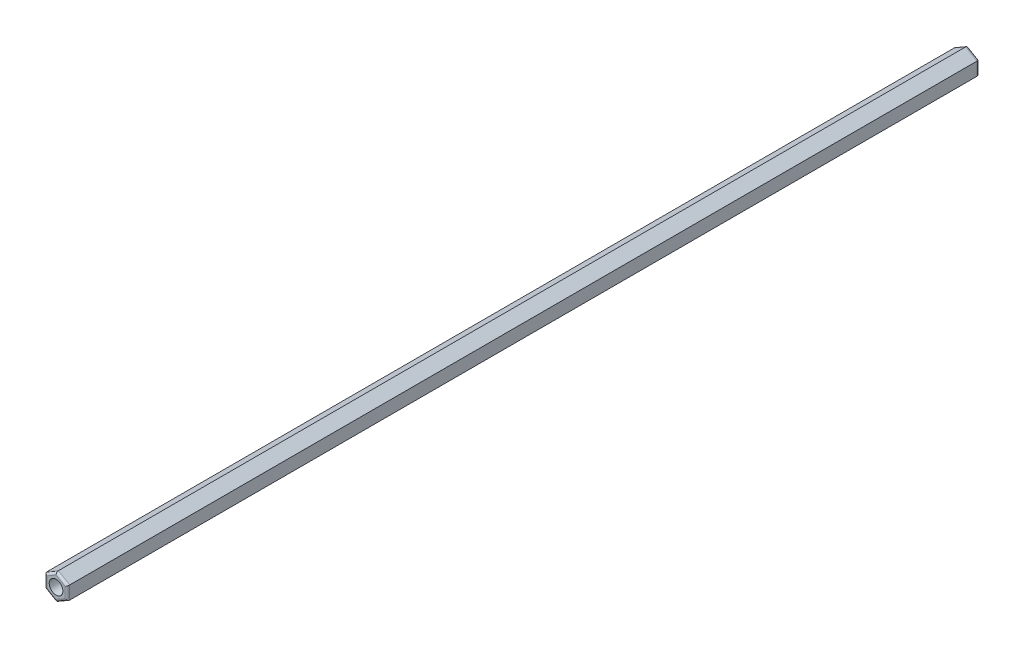
ISO-10303-21;
HEADER;
FILE_DESCRIPTION(('STEP AP214'),'2;1');
FILE_NAME('part.step','',(''),(''),'','','');
FILE_SCHEMA(('AUTOMOTIVE_DESIGN { 1 0 10303 214 1 1 1 1 }'));
ENDSEC;
DATA;
#1=APPLICATION_CONTEXT('core data for automotive mechanical design processes');
#2=APPLICATION_PROTOCOL_DEFINITION('international standard','automotive_design',2000,#1);
#3=PRODUCT_CONTEXT('',#1,'mechanical');
#4=PRODUCT('Part','Part','',(#3));
#5=PRODUCT_RELATED_PRODUCT_CATEGORY('part','',(#4));
#6=PRODUCT_DEFINITION_FORMATION('','',#4);
#7=PRODUCT_DEFINITION_CONTEXT('part definition',#1,'design');
#8=PRODUCT_DEFINITION('design','',#6,#7);
#9=PRODUCT_DEFINITION_SHAPE('','',#8);
#10=(LENGTH_UNIT() NAMED_UNIT(*) SI_UNIT(.MILLI.,.METRE.));
#11=(NAMED_UNIT(*) PLANE_ANGLE_UNIT() SI_UNIT($,.RADIAN.));
#12=(NAMED_UNIT(*) SI_UNIT($,.STERADIAN.) SOLID_ANGLE_UNIT());
#13=UNCERTAINTY_MEASURE_WITH_UNIT(LENGTH_MEASURE(1.E-05),#10,'distance_accuracy_value','');
#14=(GEOMETRIC_REPRESENTATION_CONTEXT(3) GLOBAL_UNCERTAINTY_ASSIGNED_CONTEXT((#13)) GLOBAL_UNIT_ASSIGNED_CONTEXT((#10,
#11,#12)) REPRESENTATION_CONTEXT('',''));
#15=CARTESIAN_POINT('',(0.,0.,0.));
#16=DIRECTION('',(0.,0.,1.));
#17=DIRECTION('',(1.,0.,0.));
#18=AXIS2_PLACEMENT_3D('',#15,#16,#17);
#19=CARTESIAN_POINT('',(-67.50212267549,1.44337567297406,200.));
#20=DIRECTION('',(1.,0.,0.));
#21=DIRECTION('',(0.,0.,-1.));
#22=AXIS2_PLACEMENT_3D('',#19,#20,#21);
#23=PLANE('',#22);
#24=DIRECTION('',(0.,0.,-1.));
#25=VECTOR('',#24,1.);
#26=CARTESIAN_POINT('',(-67.50212267549,-1.44337567297407,200.));
#27=LINE('',#26,#25);
#28=CARTESIAN_POINT('',(-67.50212267549,-1.44337567297407,199.5));
#29=VERTEX_POINT('',#28);
#30=CARTESIAN_POINT('',(-67.50212267549,-1.44337567297407,0.5));
#31=VERTEX_POINT('',#30);
#32=EDGE_CURVE('E152',#29,#31,#27,.T.);
#33=ORIENTED_EDGE('',*,*,#32,.T.);
#34=DIRECTION('',(0.,-1.,0.));
#35=VECTOR('',#34,1.);
#36=CARTESIAN_POINT('',(-67.50212267549,1.44337567297406,0.5));
#37=LINE('',#36,#35);
#38=CARTESIAN_POINT('',(-67.50212267549,1.44337567297406,0.5));
#39=VERTEX_POINT('',#38);
#40=EDGE_CURVE('E149',#31,#39,#37,.F.);
#41=ORIENTED_EDGE('',*,*,#40,.T.);
#42=DIRECTION('',(0.,0.,-1.));
#43=VECTOR('',#42,1.);
#44=CARTESIAN_POINT('',(-67.50212267549,1.44337567297406,200.));
#45=LINE('',#44,#43);
#46=CARTESIAN_POINT('',(-67.50212267549,1.44337567297406,199.5));
#47=VERTEX_POINT('',#46);
#48=EDGE_CURVE('E146',#47,#39,#45,.T.);
#49=ORIENTED_EDGE('',*,*,#48,.F.);
#50=DIRECTION('',(0.,-1.,0.));
#51=VECTOR('',#50,1.);
#52=CARTESIAN_POINT('',(-67.50212267549,-1.44337567297407,199.5));
#53=LINE('',#52,#51);
#54=EDGE_CURVE('E206',#47,#29,#53,.T.);
#55=ORIENTED_EDGE('',*,*,#54,.T.);
#56=EDGE_LOOP('',(#33,#41,#49,#55));
#57=FACE_BOUND('',#56,.T.);
#58=ADVANCED_FACE('F32',(#57),#23,.T.);
#59=CARTESIAN_POINT('',(-70.00212267549,2.88675134594811,200.));
#60=DIRECTION('',(0.5,0.866025403784439,0.));
#61=DIRECTION('',(-0.866025403784439,0.5,0.));
#62=AXIS2_PLACEMENT_3D('',#59,#60,#61);
#63=PLANE('',#62);
#64=ORIENTED_EDGE('',*,*,#48,.T.);
#65=DIRECTION('',(0.866025403784439,-0.5,0.));
#66=VECTOR('',#65,1.);
#67=CARTESIAN_POINT('',(-70.00212267549,2.88675134594811,0.5));
#68=LINE('',#67,#66);
#69=CARTESIAN_POINT('',(-70.00212267549,2.88675134594811,0.5));
#70=VERTEX_POINT('',#69);
#71=EDGE_CURVE('E191',#39,#70,#68,.F.);
#72=ORIENTED_EDGE('',*,*,#71,.T.);
#73=DIRECTION('',(0.,0.,-1.));
#74=VECTOR('',#73,1.);
#75=CARTESIAN_POINT('',(-70.00212267549,2.88675134594811,200.));
#76=LINE('',#75,#74);
#77=CARTESIAN_POINT('',(-70.00212267549,2.88675134594811,199.5));
#78=VERTEX_POINT('',#77);
#79=EDGE_CURVE('E255',#78,#70,#76,.T.);
#80=ORIENTED_EDGE('',*,*,#79,.F.);
#81=DIRECTION('',(0.866025403784439,-0.5,0.));
#82=VECTOR('',#81,1.);
#83=CARTESIAN_POINT('',(-67.50212267549,1.44337567297406,199.5));
#84=LINE('',#83,#82);
#85=EDGE_CURVE('E197',#78,#47,#84,.T.);
#86=ORIENTED_EDGE('',*,*,#85,.T.);
#87=EDGE_LOOP('',(#64,#72,#80,#86));
#88=FACE_BOUND('',#87,.T.);
#89=ADVANCED_FACE('F284',(#88),#63,.T.);
#90=CARTESIAN_POINT('',(-72.50212267549,1.44337567297405,200.));
#91=DIRECTION('',(-0.5,0.866025403784438,0.));
#92=DIRECTION('',(-0.866025403784439,-0.5,0.));
#93=AXIS2_PLACEMENT_3D('',#90,#91,#92);
#94=PLANE('',#93);
#95=ORIENTED_EDGE('',*,*,#79,.T.);
#96=DIRECTION('',(0.866025403784439,0.5,0.));
#97=VECTOR('',#96,1.);
#98=CARTESIAN_POINT('',(-72.50212267549,1.44337567297405,0.5));
#99=LINE('',#98,#97);
#100=CARTESIAN_POINT('',(-72.50212267549,1.44337567297405,0.5));
#101=VERTEX_POINT('',#100);
#102=EDGE_CURVE('E231',#70,#101,#99,.F.);
#103=ORIENTED_EDGE('',*,*,#102,.T.);
#104=DIRECTION('',(0.,0.,-1.));
#105=VECTOR('',#104,1.);
#106=CARTESIAN_POINT('',(-72.50212267549,1.44337567297405,200.));
#107=LINE('',#106,#105);
#108=CARTESIAN_POINT('',(-72.50212267549,1.44337567297405,199.5));
#109=VERTEX_POINT('',#108);
#110=EDGE_CURVE('E253',#109,#101,#107,.T.);
#111=ORIENTED_EDGE('',*,*,#110,.F.);
#112=DIRECTION('',(0.866025403784439,0.5,0.));
#113=VECTOR('',#112,1.);
#114=CARTESIAN_POINT('',(-70.00212267549,2.88675134594811,199.5));
#115=LINE('',#114,#113);
#116=EDGE_CURVE('E234',#109,#78,#115,.T.);
#117=ORIENTED_EDGE('',*,*,#116,.T.);
#118=EDGE_LOOP('',(#95,#103,#111,#117));
#119=FACE_BOUND('',#118,.T.);
#120=ADVANCED_FACE('F290',(#119),#94,.T.);
#121=CARTESIAN_POINT('',(-72.50212267549,-1.44337567297407,200.));
#122=DIRECTION('',(-1.,0.,0.));
#123=DIRECTION('',(0.,0.,1.));
#124=AXIS2_PLACEMENT_3D('',#121,#122,#123);
#125=PLANE('',#124);
#126=ORIENTED_EDGE('',*,*,#110,.T.);
#127=DIRECTION('',(0.,1.,0.));
#128=VECTOR('',#127,1.);
#129=CARTESIAN_POINT('',(-72.50212267549,-1.44337567297407,0.5));
#130=LINE('',#129,#128);
#131=CARTESIAN_POINT('',(-72.50212267549,-1.44337567297407,0.5));
#132=VERTEX_POINT('',#131);
#133=EDGE_CURVE('E201',#101,#132,#130,.F.);
#134=ORIENTED_EDGE('',*,*,#133,.T.);
#135=DIRECTION('',(0.,0.,-1.));
#136=VECTOR('',#135,1.);
#137=CARTESIAN_POINT('',(-72.50212267549,-1.44337567297407,200.));
#138=LINE('',#137,#136);
#139=CARTESIAN_POINT('',(-72.50212267549,-1.44337567297407,199.5));
#140=VERTEX_POINT('',#139);
#141=EDGE_CURVE('E250',#140,#132,#138,.T.);
#142=ORIENTED_EDGE('',*,*,#141,.F.);
#143=DIRECTION('',(0.,1.,0.));
#144=VECTOR('',#143,1.);
#145=CARTESIAN_POINT('',(-72.50212267549,1.44337567297405,199.5));
#146=LINE('',#145,#144);
#147=EDGE_CURVE('E226',#140,#109,#146,.T.);
#148=ORIENTED_EDGE('',*,*,#147,.T.);
#149=EDGE_LOOP('',(#126,#134,#142,#148));
#150=FACE_BOUND('',#149,.T.);
#151=ADVANCED_FACE('F341',(#150),#125,.T.);
#152=CARTESIAN_POINT('',(-70.00212267549,-2.88675134594813,200.));
#153=DIRECTION('',(-0.499999999999999,-0.866025403784439,0.));
#154=DIRECTION('',(0.866025403784439,-0.499999999999999,0.));
#155=AXIS2_PLACEMENT_3D('',#152,#153,#154);
#156=PLANE('',#155);
#157=ORIENTED_EDGE('',*,*,#141,.T.);
#158=DIRECTION('',(-0.866025403784439,0.499999999999999,0.));
#159=VECTOR('',#158,1.);
#160=CARTESIAN_POINT('',(-70.00212267549,-2.88675134594813,0.5));
#161=LINE('',#160,#159);
#162=CARTESIAN_POINT('',(-70.00212267549,-2.88675134594813,0.5));
#163=VERTEX_POINT('',#162);
#164=EDGE_CURVE('E199',#132,#163,#161,.F.);
#165=ORIENTED_EDGE('',*,*,#164,.T.);
#166=DIRECTION('',(0.,0.,-1.));
#167=VECTOR('',#166,1.);
#168=CARTESIAN_POINT('',(-70.00212267549,-2.88675134594813,200.));
#169=LINE('',#168,#167);
#170=CARTESIAN_POINT('',(-70.00212267549,-2.88675134594813,199.5));
#171=VERTEX_POINT('',#170);
#172=EDGE_CURVE('E247',#171,#163,#169,.T.);
#173=ORIENTED_EDGE('',*,*,#172,.F.);
#174=DIRECTION('',(-0.866025403784439,0.499999999999999,0.));
#175=VECTOR('',#174,1.);
#176=CARTESIAN_POINT('',(-72.50212267549,-1.44337567297407,199.5));
#177=LINE('',#176,#175);
#178=EDGE_CURVE('E196',#171,#140,#177,.T.);
#179=ORIENTED_EDGE('',*,*,#178,.T.);
#180=EDGE_LOOP('',(#157,#165,#173,#179));
#181=FACE_BOUND('',#180,.T.);
#182=ADVANCED_FACE('F280',(#181),#156,.T.);
#183=CARTESIAN_POINT('',(-67.50212267549,-1.44337567297407,200.));
#184=DIRECTION('',(0.500000000000001,-0.866025403784438,0.));
#185=DIRECTION('',(0.866025403784438,0.500000000000001,0.));
#186=AXIS2_PLACEMENT_3D('',#183,#184,#185);
#187=PLANE('',#186);
#188=ORIENTED_EDGE('',*,*,#172,.T.);
#189=DIRECTION('',(-0.866025403784438,-0.500000000000001,0.));
#190=VECTOR('',#189,1.);
#191=CARTESIAN_POINT('',(-67.50212267549,-1.44337567297407,0.5));
#192=LINE('',#191,#190);
#193=EDGE_CURVE('E211',#163,#31,#192,.F.);
#194=ORIENTED_EDGE('',*,*,#193,.T.);
#195=ORIENTED_EDGE('',*,*,#32,.F.);
#196=DIRECTION('',(-0.866025403784438,-0.500000000000001,0.));
#197=VECTOR('',#196,1.);
#198=CARTESIAN_POINT('',(-70.00212267549,-2.88675134594813,199.5));
#199=LINE('',#198,#197);
#200=EDGE_CURVE('E209',#29,#171,#199,.T.);
#201=ORIENTED_EDGE('',*,*,#200,.T.);
#202=EDGE_LOOP('',(#188,#194,#195,#201));
#203=FACE_BOUND('',#202,.T.);
#204=ADVANCED_FACE('F273',(#203),#187,.T.);
#205=CARTESIAN_POINT('',(0.,0.,200.));
#206=DIRECTION('',(0.,0.,-1.));
#207=DIRECTION('',(-1.,0.,0.));
#208=AXIS2_PLACEMENT_3D('',#205,#206,#207);
#209=PLANE('',#208);
#210=CARTESIAN_POINT('',(-70.00212267549,0.,200.));
#211=DIRECTION('',(0.,0.,1.));
#212=DIRECTION('',(1.,0.,0.));
#213=AXIS2_PLACEMENT_3D('',#210,#211,#212);
#214=CIRCLE('',#213,1.5);
#215=CARTESIAN_POINT('',(-68.50212267549,0.,200.));
#216=VERTEX_POINT('',#215);
#217=EDGE_CURVE('E258',#216,#216,#214,.T.);
#218=ORIENTED_EDGE('',*,*,#217,.F.);
#219=EDGE_LOOP('',(#218));
#220=FACE_BOUND('',#219,.T.);
#221=DIRECTION('',(0.866025403784439,-0.5,0.));
#222=VECTOR('',#221,1.);
#223=CARTESIAN_POINT('',(-70.25212267549,2.45373864405589,200.));
#224=LINE('',#223,#222);
#225=CARTESIAN_POINT('',(-68.00212267549,1.15470053837924,200.));
#226=VERTEX_POINT('',#225);
#227=CARTESIAN_POINT('',(-70.00212267549,2.30940107675849,200.));
#228=VERTEX_POINT('',#227);
#229=EDGE_CURVE('E56',#226,#228,#224,.F.);
#230=ORIENTED_EDGE('',*,*,#229,.T.);
#231=DIRECTION('',(0.866025403784439,0.5,0.));
#232=VECTOR('',#231,1.);
#233=CARTESIAN_POINT('',(-72.25212267549,1.01036297108183,200.));
#234=LINE('',#233,#232);
#235=CARTESIAN_POINT('',(-72.00212267549,1.15470053837923,200.));
#236=VERTEX_POINT('',#235);
#237=EDGE_CURVE('E11',#228,#236,#234,.F.);
#238=ORIENTED_EDGE('',*,*,#237,.T.);
#239=DIRECTION('',(0.,1.,0.));
#240=VECTOR('',#239,1.);
#241=CARTESIAN_POINT('',(-72.00212267549,-1.44337567297407,200.));
#242=LINE('',#241,#240);
#243=CARTESIAN_POINT('',(-72.00212267549,-1.15470053837925,200.));
#244=VERTEX_POINT('',#243);
#245=EDGE_CURVE('E41',#236,#244,#242,.F.);
#246=ORIENTED_EDGE('',*,*,#245,.T.);
#247=DIRECTION('',(-0.866025403784439,0.499999999999999,0.));
#248=VECTOR('',#247,1.);
#249=CARTESIAN_POINT('',(-69.75212267549,-2.45373864405591,200.));
#250=LINE('',#249,#248);
#251=CARTESIAN_POINT('',(-70.00212267549,-2.3094010767585,200.));
#252=VERTEX_POINT('',#251);
#253=EDGE_CURVE('E217',#244,#252,#250,.F.);
#254=ORIENTED_EDGE('',*,*,#253,.T.);
#255=DIRECTION('',(-0.866025403784438,-0.500000000000001,0.));
#256=VECTOR('',#255,1.);
#257=CARTESIAN_POINT('',(-67.75212267549,-1.01036297108185,200.));
#258=LINE('',#257,#256);
#259=CARTESIAN_POINT('',(-68.00212267549,-1.15470053837925,200.));
#260=VERTEX_POINT('',#259);
#261=EDGE_CURVE('E213',#252,#260,#258,.F.);
#262=ORIENTED_EDGE('',*,*,#261,.T.);
#263=DIRECTION('',(0.,-1.,0.));
#264=VECTOR('',#263,1.);
#265=CARTESIAN_POINT('',(-68.00212267549,1.44337567297406,200.));
#266=LINE('',#265,#264);
#267=EDGE_CURVE('E215',#260,#226,#266,.F.);
#268=ORIENTED_EDGE('',*,*,#267,.T.);
#269=EDGE_LOOP('',(#230,#238,#246,#254,#262,#268));
#270=FACE_BOUND('',#269,.T.);
#271=ADVANCED_FACE('F219',(#220,#270),#209,.F.);
#272=CARTESIAN_POINT('',(0.,0.,0.));
#273=DIRECTION('',(0.,0.,-1.));
#274=DIRECTION('',(-1.,0.,0.));
#275=AXIS2_PLACEMENT_3D('',#272,#273,#274);
#276=PLANE('',#275);
#277=CARTESIAN_POINT('',(-70.00212267549,0.,0.));
#278=DIRECTION('',(0.,0.,1.));
#279=DIRECTION('',(1.,0.,0.));
#280=AXIS2_PLACEMENT_3D('',#277,#278,#279);
#281=CIRCLE('',#280,1.5);
#282=CARTESIAN_POINT('',(-68.50212267549,0.,0.));
#283=VERTEX_POINT('',#282);
#284=EDGE_CURVE('E161',#283,#283,#281,.T.);
#285=ORIENTED_EDGE('',*,*,#284,.T.);
#286=EDGE_LOOP('',(#285));
#287=FACE_BOUND('',#286,.T.);
#288=DIRECTION('',(0.,1.,0.));
#289=VECTOR('',#288,1.);
#290=CARTESIAN_POINT('',(-72.00212267549,0.,0.));
#291=LINE('',#290,#289);
#292=CARTESIAN_POINT('',(-72.00212267549,-1.15470053837925,0.));
#293=VERTEX_POINT('',#292);
#294=CARTESIAN_POINT('',(-72.00212267549,1.15470053837924,0.));
#295=VERTEX_POINT('',#294);
#296=EDGE_CURVE('E241',#293,#295,#291,.T.);
#297=ORIENTED_EDGE('',*,*,#296,.T.);
#298=DIRECTION('',(0.866025403784439,0.5,0.));
#299=VECTOR('',#298,1.);
#300=CARTESIAN_POINT('',(-18.5005306688725,32.0438590854734,0.));
#301=LINE('',#300,#299);
#302=CARTESIAN_POINT('',(-70.00212267549,2.30940107675848,0.));
#303=VERTEX_POINT('',#302);
#304=EDGE_CURVE('E239',#295,#303,#301,.T.);
#305=ORIENTED_EDGE('',*,*,#304,.T.);
#306=DIRECTION('',(0.866025403784439,-0.5,0.));
#307=VECTOR('',#306,1.);
#308=CARTESIAN_POINT('',(-16.5005306688725,-28.5797574703356,0.));
#309=LINE('',#308,#307);
#310=CARTESIAN_POINT('',(-68.00212267549,1.15470053837924,0.));
#311=VERTEX_POINT('',#310);
#312=EDGE_CURVE('E130',#303,#311,#309,.T.);
#313=ORIENTED_EDGE('',*,*,#312,.T.);
#314=DIRECTION('',(0.,-1.,0.));
#315=VECTOR('',#314,1.);
#316=CARTESIAN_POINT('',(-68.00212267549,0.,0.));
#317=LINE('',#316,#315);
#318=CARTESIAN_POINT('',(-68.00212267549,-1.15470053837925,0.));
#319=VERTEX_POINT('',#318);
#320=EDGE_CURVE('E123',#311,#319,#317,.T.);
#321=ORIENTED_EDGE('',*,*,#320,.T.);
#322=DIRECTION('',(-0.866025403784438,-0.500000000000001,0.));
#323=VECTOR('',#322,1.);
#324=CARTESIAN_POINT('',(-16.5005306688726,28.5797574703357,0.));
#325=LINE('',#324,#323);
#326=CARTESIAN_POINT('',(-70.00212267549,-2.3094010767585,0.));
#327=VERTEX_POINT('',#326);
#328=EDGE_CURVE('E126',#319,#327,#325,.T.);
#329=ORIENTED_EDGE('',*,*,#328,.T.);
#330=DIRECTION('',(-0.866025403784439,0.499999999999999,0.));
#331=VECTOR('',#330,1.);
#332=CARTESIAN_POINT('',(-18.5005306688724,-32.0438590854734,0.));
#333=LINE('',#332,#331);
#334=EDGE_CURVE('E135',#327,#293,#333,.T.);
#335=ORIENTED_EDGE('',*,*,#334,.T.);
#336=EDGE_LOOP('',(#297,#305,#313,#321,#329,#335));
#337=FACE_BOUND('',#336,.T.);
#338=ADVANCED_FACE('F125',(#287,#337),#276,.T.);
#339=CARTESIAN_POINT('',(-16.5005306688726,28.5797574703357,0.5));
#340=DIRECTION('',(-0.866025403784438,-0.500000000000001,0.));
#341=DIRECTION('',(0.500000000000001,-0.866025403784438,0.));
#342=AXIS2_PLACEMENT_3D('',#339,#340,#341);
#343=CYLINDRICAL_SURFACE('',#342,0.5);
#344=CARTESIAN_POINT('',(-68.00212267549,-1.15470053837925,0.5));
#345=DIRECTION('',(-0.5,-0.866025403784439,0.));
#346=DIRECTION('',(-0.866025403784439,0.5,0.));
#347=AXIS2_PLACEMENT_3D('',#344,#345,#346);
#348=ELLIPSE('',#347,0.577350269189626,0.5);
#349=EDGE_CURVE('E141',#31,#319,#348,.F.);
#350=ORIENTED_EDGE('',*,*,#349,.F.);
#351=ORIENTED_EDGE('',*,*,#193,.F.);
#352=CARTESIAN_POINT('',(-70.00212267549,-2.3094010767585,0.5));
#353=DIRECTION('',(-1.,0.,0.));
#354=DIRECTION('',(0.,-1.,0.));
#355=AXIS2_PLACEMENT_3D('',#352,#353,#354);
#356=ELLIPSE('',#355,0.577350269189626,0.5);
#357=EDGE_CURVE('E144',#327,#163,#356,.T.);
#358=ORIENTED_EDGE('',*,*,#357,.F.);
#359=ORIENTED_EDGE('',*,*,#328,.F.);
#360=EDGE_LOOP('',(#350,#351,#358,#359));
#361=FACE_BOUND('',#360,.T.);
#362=ADVANCED_FACE('F139',(#361),#343,.T.);
#363=CARTESIAN_POINT('',(-18.5005306688724,-32.0438590854734,0.5));
#364=DIRECTION('',(-0.866025403784439,0.499999999999999,0.));
#365=DIRECTION('',(-0.499999999999999,-0.866025403784439,0.));
#366=AXIS2_PLACEMENT_3D('',#363,#364,#365);
#367=CYLINDRICAL_SURFACE('',#366,0.5);
#368=ORIENTED_EDGE('',*,*,#357,.T.);
#369=ORIENTED_EDGE('',*,*,#164,.F.);
#370=CARTESIAN_POINT('',(-72.00212267549,-1.15470053837926,0.5));
#371=DIRECTION('',(-0.500000000000001,0.866025403784438,0.));
#372=DIRECTION('',(-0.866025403784438,-0.500000000000001,0.));
#373=AXIS2_PLACEMENT_3D('',#370,#371,#372);
#374=ELLIPSE('',#373,0.577350269189626,0.5);
#375=EDGE_CURVE('E150',#293,#132,#374,.T.);
#376=ORIENTED_EDGE('',*,*,#375,.F.);
#377=ORIENTED_EDGE('',*,*,#334,.F.);
#378=EDGE_LOOP('',(#368,#369,#376,#377));
#379=FACE_BOUND('',#378,.T.);
#380=ADVANCED_FACE('F305',(#379),#367,.T.);
#381=CARTESIAN_POINT('',(-68.00212267549,0.,0.5));
#382=DIRECTION('',(0.,-1.,0.));
#383=DIRECTION('',(0.,0.,-1.));
#384=AXIS2_PLACEMENT_3D('',#381,#382,#383);
#385=CYLINDRICAL_SURFACE('',#384,0.5);
#386=ORIENTED_EDGE('',*,*,#349,.T.);
#387=ORIENTED_EDGE('',*,*,#320,.F.);
#388=CARTESIAN_POINT('',(-68.00212267549,1.15470053837925,0.5));
#389=DIRECTION('',(0.5,-0.866025403784439,0.));
#390=DIRECTION('',(-0.866025403784439,-0.5,0.));
#391=AXIS2_PLACEMENT_3D('',#388,#389,#390);
#392=ELLIPSE('',#391,0.577350269189626,0.5);
#393=EDGE_CURVE('E155',#39,#311,#392,.F.);
#394=ORIENTED_EDGE('',*,*,#393,.F.);
#395=ORIENTED_EDGE('',*,*,#40,.F.);
#396=EDGE_LOOP('',(#386,#387,#394,#395));
#397=FACE_BOUND('',#396,.T.);
#398=ADVANCED_FACE('F148',(#397),#385,.T.);
#399=CARTESIAN_POINT('',(-72.00212267549,0.,0.5));
#400=DIRECTION('',(0.,1.,0.));
#401=DIRECTION('',(0.,0.,1.));
#402=AXIS2_PLACEMENT_3D('',#399,#400,#401);
#403=CYLINDRICAL_SURFACE('',#402,0.5);
#404=ORIENTED_EDGE('',*,*,#375,.T.);
#405=ORIENTED_EDGE('',*,*,#133,.F.);
#406=CARTESIAN_POINT('',(-72.00212267549,1.15470053837923,0.5));
#407=DIRECTION('',(0.5,0.866025403784439,0.));
#408=DIRECTION('',(-0.866025403784439,0.5,0.));
#409=AXIS2_PLACEMENT_3D('',#406,#407,#408);
#410=ELLIPSE('',#409,0.577350269189626,0.5);
#411=EDGE_CURVE('E180',#295,#101,#410,.T.);
#412=ORIENTED_EDGE('',*,*,#411,.F.);
#413=ORIENTED_EDGE('',*,*,#296,.F.);
#414=EDGE_LOOP('',(#404,#405,#412,#413));
#415=FACE_BOUND('',#414,.T.);
#416=ADVANCED_FACE('F299',(#415),#403,.T.);
#417=CARTESIAN_POINT('',(-16.5005306688725,-28.5797574703356,0.5));
#418=DIRECTION('',(0.866025403784439,-0.5,0.));
#419=DIRECTION('',(0.5,0.866025403784439,0.));
#420=AXIS2_PLACEMENT_3D('',#417,#418,#419);
#421=CYLINDRICAL_SURFACE('',#420,0.5);
#422=ORIENTED_EDGE('',*,*,#393,.T.);
#423=ORIENTED_EDGE('',*,*,#312,.F.);
#424=CARTESIAN_POINT('',(-70.00212267549,2.30940107675848,0.5));
#425=DIRECTION('',(1.,0.,0.));
#426=DIRECTION('',(0.,-1.,0.));
#427=AXIS2_PLACEMENT_3D('',#424,#425,#426);
#428=ELLIPSE('',#427,0.577350269189626,0.5);
#429=EDGE_CURVE('E175',#70,#303,#428,.F.);
#430=ORIENTED_EDGE('',*,*,#429,.F.);
#431=ORIENTED_EDGE('',*,*,#71,.F.);
#432=EDGE_LOOP('',(#422,#423,#430,#431));
#433=FACE_BOUND('',#432,.T.);
#434=ADVANCED_FACE('F190',(#433),#421,.T.);
#435=CARTESIAN_POINT('',(-18.5005306688725,32.0438590854734,0.5));
#436=DIRECTION('',(0.866025403784439,0.5,0.));
#437=DIRECTION('',(-0.5,0.866025403784438,0.));
#438=AXIS2_PLACEMENT_3D('',#435,#436,#437);
#439=CYLINDRICAL_SURFACE('',#438,0.5);
#440=ORIENTED_EDGE('',*,*,#411,.T.);
#441=ORIENTED_EDGE('',*,*,#102,.F.);
#442=ORIENTED_EDGE('',*,*,#429,.T.);
#443=ORIENTED_EDGE('',*,*,#304,.F.);
#444=EDGE_LOOP('',(#440,#441,#442,#443));
#445=FACE_BOUND('',#444,.T.);
#446=ADVANCED_FACE('F294',(#445),#439,.T.);
#447=CARTESIAN_POINT('',(-67.75212267549,-1.01036297108185,199.5));
#448=DIRECTION('',(0.866025403784438,0.500000000000001,0.));
#449=DIRECTION('',(-0.500000000000001,0.866025403784438,0.));
#450=AXIS2_PLACEMENT_3D('',#447,#448,#449);
#451=CYLINDRICAL_SURFACE('',#450,0.5);
#452=CARTESIAN_POINT('',(-68.00212267549,-1.15470053837926,199.5));
#453=DIRECTION('',(0.5,0.866025403784439,0.));
#454=DIRECTION('',(0.866025403784439,-0.5,0.));
#455=AXIS2_PLACEMENT_3D('',#452,#453,#454);
#456=ELLIPSE('',#455,0.577350269189626,0.5);
#457=EDGE_CURVE('E168',#260,#29,#456,.T.);
#458=ORIENTED_EDGE('',*,*,#457,.F.);
#459=ORIENTED_EDGE('',*,*,#261,.F.);
#460=CARTESIAN_POINT('',(-70.00212267549,-2.3094010767585,199.5));
#461=DIRECTION('',(1.,0.,0.));
#462=DIRECTION('',(0.,1.,0.));
#463=AXIS2_PLACEMENT_3D('',#460,#461,#462);
#464=ELLIPSE('',#463,0.577350269189626,0.5);
#465=EDGE_CURVE('E36',#171,#252,#464,.F.);
#466=ORIENTED_EDGE('',*,*,#465,.F.);
#467=ORIENTED_EDGE('',*,*,#200,.F.);
#468=EDGE_LOOP('',(#458,#459,#466,#467));
#469=FACE_BOUND('',#468,.T.);
#470=ADVANCED_FACE('F34',(#469),#451,.T.);
#471=CARTESIAN_POINT('',(-69.75212267549,-2.45373864405591,199.5));
#472=DIRECTION('',(0.866025403784439,-0.499999999999999,0.));
#473=DIRECTION('',(0.499999999999999,0.866025403784439,0.));
#474=AXIS2_PLACEMENT_3D('',#471,#472,#473);
#475=CYLINDRICAL_SURFACE('',#474,0.5);
#476=ORIENTED_EDGE('',*,*,#465,.T.);
#477=ORIENTED_EDGE('',*,*,#253,.F.);
#478=CARTESIAN_POINT('',(-72.00212267549,-1.15470053837925,199.5));
#479=DIRECTION('',(0.500000000000001,-0.866025403784438,0.));
#480=DIRECTION('',(0.866025403784438,0.500000000000001,0.));
#481=AXIS2_PLACEMENT_3D('',#478,#479,#480);
#482=ELLIPSE('',#481,0.577350269189626,0.5);
#483=EDGE_CURVE('E166',#140,#244,#482,.F.);
#484=ORIENTED_EDGE('',*,*,#483,.F.);
#485=ORIENTED_EDGE('',*,*,#178,.F.);
#486=EDGE_LOOP('',(#476,#477,#484,#485));
#487=FACE_BOUND('',#486,.T.);
#488=ADVANCED_FACE('F223',(#487),#475,.T.);
#489=CARTESIAN_POINT('',(-68.00212267549,1.44337567297406,199.5));
#490=DIRECTION('',(0.,1.,0.));
#491=DIRECTION('',(0.,0.,1.));
#492=AXIS2_PLACEMENT_3D('',#489,#490,#491);
#493=CYLINDRICAL_SURFACE('',#492,0.5);
#494=ORIENTED_EDGE('',*,*,#457,.T.);
#495=ORIENTED_EDGE('',*,*,#54,.F.);
#496=CARTESIAN_POINT('',(-68.00212267549,1.15470053837924,199.5));
#497=DIRECTION('',(-0.5,0.866025403784439,0.));
#498=DIRECTION('',(0.866025403784439,0.5,0.));
#499=AXIS2_PLACEMENT_3D('',#496,#497,#498);
#500=ELLIPSE('',#499,0.577350269189626,0.5);
#501=EDGE_CURVE('E163',#226,#47,#500,.T.);
#502=ORIENTED_EDGE('',*,*,#501,.F.);
#503=ORIENTED_EDGE('',*,*,#267,.F.);
#504=EDGE_LOOP('',(#494,#495,#502,#503));
#505=FACE_BOUND('',#504,.T.);
#506=ADVANCED_FACE('F319',(#505),#493,.T.);
#507=CARTESIAN_POINT('',(-72.00212267549,-1.44337567297407,199.5));
#508=DIRECTION('',(0.,-1.,0.));
#509=DIRECTION('',(0.,0.,-1.));
#510=AXIS2_PLACEMENT_3D('',#507,#508,#509);
#511=CYLINDRICAL_SURFACE('',#510,0.5);
#512=ORIENTED_EDGE('',*,*,#483,.T.);
#513=ORIENTED_EDGE('',*,*,#245,.F.);
#514=CARTESIAN_POINT('',(-72.00212267549,1.15470053837923,199.5));
#515=DIRECTION('',(-0.5,-0.866025403784439,0.));
#516=DIRECTION('',(0.866025403784439,-0.5,0.));
#517=AXIS2_PLACEMENT_3D('',#514,#515,#516);
#518=ELLIPSE('',#517,0.577350269189626,0.5);
#519=EDGE_CURVE('E49',#109,#236,#518,.F.);
#520=ORIENTED_EDGE('',*,*,#519,.F.);
#521=ORIENTED_EDGE('',*,*,#147,.F.);
#522=EDGE_LOOP('',(#512,#513,#520,#521));
#523=FACE_BOUND('',#522,.T.);
#524=ADVANCED_FACE('F225',(#523),#511,.T.);
#525=CARTESIAN_POINT('',(-70.25212267549,2.45373864405589,199.5));
#526=DIRECTION('',(-0.866025403784439,0.5,0.));
#527=DIRECTION('',(-0.5,-0.866025403784439,0.));
#528=AXIS2_PLACEMENT_3D('',#525,#526,#527);
#529=CYLINDRICAL_SURFACE('',#528,0.5);
#530=ORIENTED_EDGE('',*,*,#501,.T.);
#531=ORIENTED_EDGE('',*,*,#85,.F.);
#532=CARTESIAN_POINT('',(-70.00212267549,2.30940107675849,199.5));
#533=DIRECTION('',(-1.,0.,0.));
#534=DIRECTION('',(0.,1.,0.));
#535=AXIS2_PLACEMENT_3D('',#532,#533,#534);
#536=ELLIPSE('',#535,0.577350269189626,0.5);
#537=EDGE_CURVE('E159',#228,#78,#536,.T.);
#538=ORIENTED_EDGE('',*,*,#537,.F.);
#539=ORIENTED_EDGE('',*,*,#229,.F.);
#540=EDGE_LOOP('',(#530,#531,#538,#539));
#541=FACE_BOUND('',#540,.T.);
#542=ADVANCED_FACE('F313',(#541),#529,.T.);
#543=CARTESIAN_POINT('',(-72.25212267549,1.01036297108183,199.5));
#544=DIRECTION('',(-0.866025403784439,-0.5,0.));
#545=DIRECTION('',(0.5,-0.866025403784438,0.));
#546=AXIS2_PLACEMENT_3D('',#543,#544,#545);
#547=CYLINDRICAL_SURFACE('',#546,0.5);
#548=ORIENTED_EDGE('',*,*,#519,.T.);
#549=ORIENTED_EDGE('',*,*,#237,.F.);
#550=ORIENTED_EDGE('',*,*,#537,.T.);
#551=ORIENTED_EDGE('',*,*,#116,.F.);
#552=EDGE_LOOP('',(#548,#549,#550,#551));
#553=FACE_BOUND('',#552,.T.);
#554=ADVANCED_FACE('F268',(#553),#547,.T.);
#555=CARTESIAN_POINT('',(-70.00212267549,0.,0.));
#556=DIRECTION('',(0.,0.,1.));
#557=DIRECTION('',(1.,0.,0.));
#558=AXIS2_PLACEMENT_3D('',#555,#556,#557);
#559=CYLINDRICAL_SURFACE('',#558,1.5);
#560=ORIENTED_EDGE('',*,*,#284,.F.);
#561=EDGE_LOOP('',(#560));
#562=FACE_BOUND('',#561,.T.);
#563=ORIENTED_EDGE('',*,*,#217,.T.);
#564=EDGE_LOOP('',(#563));
#565=FACE_BOUND('',#564,.T.);
#566=ADVANCED_FACE('F265',(#562,#565),#559,.F.);
#567=CLOSED_SHELL('',(#58,#89,#120,#151,#182,#204,#271,#338,#362,#380,#398,#416,#434,#446,#470,
#488,#506,#524,#542,#554,#566));
#568=MANIFOLD_SOLID_BREP('B2',#567);
#569=ADVANCED_BREP_SHAPE_REPRESENTATION('',(#18,#568),#14);
#570=SHAPE_DEFINITION_REPRESENTATION(#9,#569);
ENDSEC;
END-ISO-10303-21;
